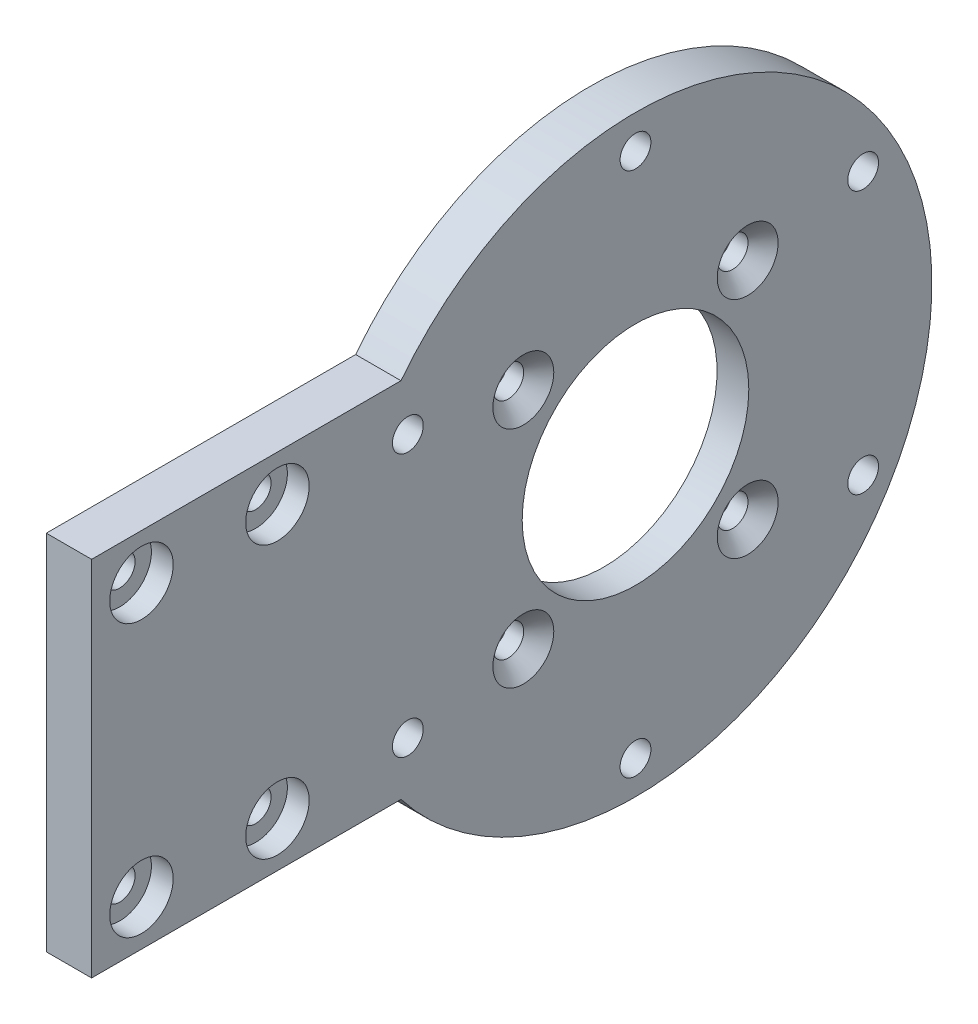
ISO-10303-21;
HEADER;
FILE_DESCRIPTION(('STEP AP214'),'2;1');
FILE_NAME('part.step','',(''),(''),'','','');
FILE_SCHEMA(('AUTOMOTIVE_DESIGN { 1 0 10303 214 1 1 1 1 }'));
ENDSEC;
DATA;
#1=APPLICATION_CONTEXT('core data for automotive mechanical design processes');
#2=APPLICATION_PROTOCOL_DEFINITION('international standard','automotive_design',2000,#1);
#3=PRODUCT_CONTEXT('',#1,'mechanical');
#4=PRODUCT('Part','Part','',(#3));
#5=PRODUCT_RELATED_PRODUCT_CATEGORY('part','',(#4));
#6=PRODUCT_DEFINITION_FORMATION('','',#4);
#7=PRODUCT_DEFINITION_CONTEXT('part definition',#1,'design');
#8=PRODUCT_DEFINITION('design','',#6,#7);
#9=PRODUCT_DEFINITION_SHAPE('','',#8);
#10=(LENGTH_UNIT() NAMED_UNIT(*) SI_UNIT(.MILLI.,.METRE.));
#11=(NAMED_UNIT(*) PLANE_ANGLE_UNIT() SI_UNIT($,.RADIAN.));
#12=(NAMED_UNIT(*) SI_UNIT($,.STERADIAN.) SOLID_ANGLE_UNIT());
#13=UNCERTAINTY_MEASURE_WITH_UNIT(LENGTH_MEASURE(1.E-05),#10,'distance_accuracy_value','');
#14=(GEOMETRIC_REPRESENTATION_CONTEXT(3) GLOBAL_UNCERTAINTY_ASSIGNED_CONTEXT((#13)) GLOBAL_UNIT_ASSIGNED_CONTEXT((#10,
#11,#12)) REPRESENTATION_CONTEXT('',''));
#15=CARTESIAN_POINT('',(0.,0.,0.));
#16=DIRECTION('',(0.,0.,1.));
#17=DIRECTION('',(1.,0.,0.));
#18=AXIS2_PLACEMENT_3D('',#15,#16,#17);
#19=CARTESIAN_POINT('',(2.5,0.,0.));
#20=DIRECTION('',(-1.,0.,0.));
#21=DIRECTION('',(0.,0.,1.));
#22=AXIS2_PLACEMENT_3D('',#19,#20,#21);
#23=CYLINDRICAL_SURFACE('',#22,12.5);
#24=CARTESIAN_POINT('',(2.5,0.,0.));
#25=DIRECTION('',(1.,0.,0.));
#26=DIRECTION('',(0.,0.,-1.));
#27=AXIS2_PLACEMENT_3D('',#24,#25,#26);
#28=CIRCLE('',#27,12.5);
#29=CARTESIAN_POINT('',(2.5,0.,-12.5));
#30=VERTEX_POINT('',#29);
#31=EDGE_CURVE('E104',#30,#30,#28,.T.);
#32=ORIENTED_EDGE('',*,*,#31,.T.);
#33=EDGE_LOOP('',(#32));
#34=FACE_BOUND('',#33,.T.);
#35=CARTESIAN_POINT('',(-1.,0.,0.));
#36=DIRECTION('',(-1.,0.,0.));
#37=DIRECTION('',(0.,0.,1.));
#38=AXIS2_PLACEMENT_3D('',#35,#36,#37);
#39=CIRCLE('',#38,12.5);
#40=CARTESIAN_POINT('',(-1.,0.,12.5));
#41=VERTEX_POINT('',#40);
#42=EDGE_CURVE('E110',#41,#41,#39,.T.);
#43=ORIENTED_EDGE('',*,*,#42,.T.);
#44=EDGE_LOOP('',(#43));
#45=FACE_BOUND('',#44,.T.);
#46=ADVANCED_FACE('F33',(#34,#45),#23,.F.);
#47=CARTESIAN_POINT('',(2.5,0.,0.));
#48=DIRECTION('',(1.,0.,0.));
#49=DIRECTION('',(0.,0.,-1.));
#50=AXIS2_PLACEMENT_3D('',#47,#48,#49);
#51=PLANE('',#50);
#52=CARTESIAN_POINT('',(2.5,15.,39.5));
#53=DIRECTION('',(1.,0.,0.));
#54=DIRECTION('',(0.,0.,-1.));
#55=AXIS2_PLACEMENT_3D('',#52,#53,#54);
#56=CIRCLE('',#55,3.5);
#57=CARTESIAN_POINT('',(2.5,15.,36.));
#58=VERTEX_POINT('',#57);
#59=EDGE_CURVE('E609',#58,#58,#56,.T.);
#60=ORIENTED_EDGE('',*,*,#59,.F.);
#61=EDGE_LOOP('',(#60));
#62=FACE_BOUND('',#61,.T.);
#63=CARTESIAN_POINT('',(2.5,-15.,54.5));
#64=DIRECTION('',(1.,0.,0.));
#65=DIRECTION('',(0.,0.,-1.));
#66=AXIS2_PLACEMENT_3D('',#63,#64,#65);
#67=CIRCLE('',#66,3.5);
#68=CARTESIAN_POINT('',(2.5,-15.,51.));
#69=VERTEX_POINT('',#68);
#70=EDGE_CURVE('E597',#69,#69,#67,.T.);
#71=ORIENTED_EDGE('',*,*,#70,.F.);
#72=EDGE_LOOP('',(#71));
#73=FACE_BOUND('',#72,.T.);
#74=CARTESIAN_POINT('',(2.5,15.,54.5));
#75=DIRECTION('',(1.,0.,0.));
#76=DIRECTION('',(0.,0.,-1.));
#77=AXIS2_PLACEMENT_3D('',#74,#75,#76);
#78=CIRCLE('',#77,3.5);
#79=CARTESIAN_POINT('',(2.5,15.,51.));
#80=VERTEX_POINT('',#79);
#81=EDGE_CURVE('E585',#80,#80,#78,.T.);
#82=ORIENTED_EDGE('',*,*,#81,.F.);
#83=EDGE_LOOP('',(#82));
#84=FACE_BOUND('',#83,.T.);
#85=CARTESIAN_POINT('',(2.5,-15.,39.5));
#86=DIRECTION('',(1.,0.,0.));
#87=DIRECTION('',(0.,0.,-1.));
#88=AXIS2_PLACEMENT_3D('',#85,#86,#87);
#89=CIRCLE('',#88,3.5);
#90=CARTESIAN_POINT('',(2.5,-15.,36.));
#91=VERTEX_POINT('',#90);
#92=EDGE_CURVE('E573',#91,#91,#89,.T.);
#93=ORIENTED_EDGE('',*,*,#92,.F.);
#94=EDGE_LOOP('',(#93));
#95=FACE_BOUND('',#94,.T.);
#96=CARTESIAN_POINT('',(2.5,29.,0.));
#97=DIRECTION('',(1.,0.,0.));
#98=DIRECTION('',(0.,0.,-1.));
#99=AXIS2_PLACEMENT_3D('',#96,#97,#98);
#100=CIRCLE('',#99,1.69999999999999);
#101=CARTESIAN_POINT('',(2.5,29.,-1.69999999999999));
#102=VERTEX_POINT('',#101);
#103=EDGE_CURVE('E561',#102,#102,#100,.T.);
#104=ORIENTED_EDGE('',*,*,#103,.F.);
#105=EDGE_LOOP('',(#104));
#106=FACE_BOUND('',#105,.T.);
#107=CARTESIAN_POINT('',(2.5,14.5,-25.1147367097487));
#108=DIRECTION('',(1.,0.,0.));
#109=DIRECTION('',(0.,0.,-1.));
#110=AXIS2_PLACEMENT_3D('',#107,#108,#109);
#111=CIRCLE('',#110,1.69999999999999);
#112=CARTESIAN_POINT('',(2.5,14.5,-26.8147367097487));
#113=VERTEX_POINT('',#112);
#114=EDGE_CURVE('E555',#113,#113,#111,.T.);
#115=ORIENTED_EDGE('',*,*,#114,.F.);
#116=EDGE_LOOP('',(#115));
#117=FACE_BOUND('',#116,.T.);
#118=CARTESIAN_POINT('',(2.5,-14.5,-25.1147367097487));
#119=DIRECTION('',(1.,0.,0.));
#120=DIRECTION('',(0.,0.,-1.));
#121=AXIS2_PLACEMENT_3D('',#118,#119,#120);
#122=CIRCLE('',#121,1.69999999999999);
#123=CARTESIAN_POINT('',(2.5,-14.5,-26.8147367097487));
#124=VERTEX_POINT('',#123);
#125=EDGE_CURVE('E549',#124,#124,#122,.T.);
#126=ORIENTED_EDGE('',*,*,#125,.F.);
#127=EDGE_LOOP('',(#126));
#128=FACE_BOUND('',#127,.T.);
#129=CARTESIAN_POINT('',(2.5,-29.,0.));
#130=DIRECTION('',(1.,0.,0.));
#131=DIRECTION('',(0.,0.,-1.));
#132=AXIS2_PLACEMENT_3D('',#129,#130,#131);
#133=CIRCLE('',#132,1.69999999999999);
#134=CARTESIAN_POINT('',(2.5,-29.,-1.69999999999999));
#135=VERTEX_POINT('',#134);
#136=EDGE_CURVE('E543',#135,#135,#133,.T.);
#137=ORIENTED_EDGE('',*,*,#136,.F.);
#138=EDGE_LOOP('',(#137));
#139=FACE_BOUND('',#138,.T.);
#140=CARTESIAN_POINT('',(2.5,-14.5,25.1147367097487));
#141=DIRECTION('',(1.,0.,0.));
#142=DIRECTION('',(0.,0.,-1.));
#143=AXIS2_PLACEMENT_3D('',#140,#141,#142);
#144=CIRCLE('',#143,1.69999999999999);
#145=CARTESIAN_POINT('',(2.5,-14.5,23.4147367097487));
#146=VERTEX_POINT('',#145);
#147=EDGE_CURVE('E537',#146,#146,#144,.T.);
#148=ORIENTED_EDGE('',*,*,#147,.F.);
#149=EDGE_LOOP('',(#148));
#150=FACE_BOUND('',#149,.T.);
#151=CARTESIAN_POINT('',(2.5,14.5,25.1147367097487));
#152=DIRECTION('',(1.,0.,0.));
#153=DIRECTION('',(0.,0.,-1.));
#154=AXIS2_PLACEMENT_3D('',#151,#152,#153);
#155=CIRCLE('',#154,1.69999999999999);
#156=CARTESIAN_POINT('',(2.5,14.5,23.4147367097487));
#157=VERTEX_POINT('',#156);
#158=EDGE_CURVE('E531',#157,#157,#155,.T.);
#159=ORIENTED_EDGE('',*,*,#158,.F.);
#160=EDGE_LOOP('',(#159));
#161=FACE_BOUND('',#160,.T.);
#162=CARTESIAN_POINT('',(2.5,12.3743686707646,-12.3743686707646));
#163=DIRECTION('',(1.,0.,0.));
#164=DIRECTION('',(0.,0.,-1.));
#165=AXIS2_PLACEMENT_3D('',#162,#163,#164);
#166=CIRCLE('',#165,3.36);
#167=CARTESIAN_POINT('',(2.5,12.3743686707646,-15.7343686707646));
#168=VERTEX_POINT('',#167);
#169=EDGE_CURVE('E522',#168,#168,#166,.T.);
#170=ORIENTED_EDGE('',*,*,#169,.F.);
#171=EDGE_LOOP('',(#170));
#172=FACE_BOUND('',#171,.T.);
#173=CARTESIAN_POINT('',(2.5,-12.3743686707646,12.3743686707646));
#174=DIRECTION('',(1.,0.,0.));
#175=DIRECTION('',(0.,0.,-1.));
#176=AXIS2_PLACEMENT_3D('',#173,#174,#175);
#177=CIRCLE('',#176,3.36);
#178=CARTESIAN_POINT('',(2.5,-12.3743686707646,9.01436867076458));
#179=VERTEX_POINT('',#178);
#180=EDGE_CURVE('E132',#179,#179,#177,.T.);
#181=ORIENTED_EDGE('',*,*,#180,.F.);
#182=EDGE_LOOP('',(#181));
#183=FACE_BOUND('',#182,.T.);
#184=CARTESIAN_POINT('',(2.5,12.3743686707646,12.3743686707646));
#185=DIRECTION('',(1.,0.,0.));
#186=DIRECTION('',(0.,0.,-1.));
#187=AXIS2_PLACEMENT_3D('',#184,#185,#186);
#188=CIRCLE('',#187,3.36);
#189=CARTESIAN_POINT('',(2.5,12.3743686707646,9.01436867076458));
#190=VERTEX_POINT('',#189);
#191=EDGE_CURVE('E125',#190,#190,#188,.T.);
#192=ORIENTED_EDGE('',*,*,#191,.F.);
#193=EDGE_LOOP('',(#192));
#194=FACE_BOUND('',#193,.T.);
#195=CARTESIAN_POINT('',(2.5,-12.3743686707646,-12.3743686707646));
#196=DIRECTION('',(1.,0.,0.));
#197=DIRECTION('',(0.,0.,-1.));
#198=AXIS2_PLACEMENT_3D('',#195,#196,#197);
#199=CIRCLE('',#198,3.36);
#200=CARTESIAN_POINT('',(2.5,-12.3743686707646,-15.7343686707646));
#201=VERTEX_POINT('',#200);
#202=EDGE_CURVE('E121',#201,#201,#199,.T.);
#203=ORIENTED_EDGE('',*,*,#202,.F.);
#204=EDGE_LOOP('',(#203));
#205=FACE_BOUND('',#204,.T.);
#206=CARTESIAN_POINT('',(2.5,0.,0.));
#207=DIRECTION('',(1.,0.,0.));
#208=DIRECTION('',(0.,0.,-1.));
#209=AXIS2_PLACEMENT_3D('',#206,#207,#208);
#210=CIRCLE('',#209,32.7);
#211=CARTESIAN_POINT('',(2.5,-20.,25.8706397292375));
#212=VERTEX_POINT('',#211);
#213=CARTESIAN_POINT('',(2.5,20.,25.8706397292375));
#214=VERTEX_POINT('',#213);
#215=EDGE_CURVE('E88',#212,#214,#210,.T.);
#216=ORIENTED_EDGE('',*,*,#215,.T.);
#217=DIRECTION('',(0.,0.,1.));
#218=VECTOR('',#217,1.);
#219=CARTESIAN_POINT('',(2.5,20.,25.8706397292375));
#220=LINE('',#219,#218);
#221=CARTESIAN_POINT('',(2.5,20.,60.));
#222=VERTEX_POINT('',#221);
#223=EDGE_CURVE('E82',#214,#222,#220,.T.);
#224=ORIENTED_EDGE('',*,*,#223,.T.);
#225=DIRECTION('',(0.,-1.,0.));
#226=VECTOR('',#225,1.);
#227=CARTESIAN_POINT('',(2.5,20.,60.));
#228=LINE('',#227,#226);
#229=CARTESIAN_POINT('',(2.5,-20.,60.));
#230=VERTEX_POINT('',#229);
#231=EDGE_CURVE('E86',#222,#230,#228,.T.);
#232=ORIENTED_EDGE('',*,*,#231,.T.);
#233=DIRECTION('',(0.,0.,-1.));
#234=VECTOR('',#233,1.);
#235=CARTESIAN_POINT('',(2.5,-20.,60.));
#236=LINE('',#235,#234);
#237=EDGE_CURVE('E52',#230,#212,#236,.T.);
#238=ORIENTED_EDGE('',*,*,#237,.T.);
#239=EDGE_LOOP('',(#216,#224,#232,#238));
#240=FACE_BOUND('',#239,.T.);
#241=ORIENTED_EDGE('',*,*,#31,.F.);
#242=EDGE_LOOP('',(#241));
#243=FACE_BOUND('',#242,.T.);
#244=ADVANCED_FACE('F83',(#62,#73,#84,#95,#106,#117,#128,#139,#150,#161,#172,#183,#194,#205,
#240,#243),#51,.T.);
#245=CARTESIAN_POINT('',(-2.5,0.,0.));
#246=DIRECTION('',(1.,0.,0.));
#247=DIRECTION('',(0.,0.,-1.));
#248=AXIS2_PLACEMENT_3D('',#245,#246,#247);
#249=PLANE('',#248);
#250=CARTESIAN_POINT('',(-2.5,15.,39.5));
#251=DIRECTION('',(1.,0.,0.));
#252=DIRECTION('',(0.,0.,-1.));
#253=AXIS2_PLACEMENT_3D('',#250,#251,#252);
#254=CIRCLE('',#253,1.7);
#255=CARTESIAN_POINT('',(-2.5,15.,37.8));
#256=VERTEX_POINT('',#255);
#257=EDGE_CURVE('E600',#256,#256,#254,.T.);
#258=ORIENTED_EDGE('',*,*,#257,.T.);
#259=EDGE_LOOP('',(#258));
#260=FACE_BOUND('',#259,.T.);
#261=CARTESIAN_POINT('',(-2.5,-15.,54.5));
#262=DIRECTION('',(1.,0.,0.));
#263=DIRECTION('',(0.,0.,-1.));
#264=AXIS2_PLACEMENT_3D('',#261,#262,#263);
#265=CIRCLE('',#264,1.7);
#266=CARTESIAN_POINT('',(-2.5,-15.,52.8));
#267=VERTEX_POINT('',#266);
#268=EDGE_CURVE('E588',#267,#267,#265,.T.);
#269=ORIENTED_EDGE('',*,*,#268,.T.);
#270=EDGE_LOOP('',(#269));
#271=FACE_BOUND('',#270,.T.);
#272=CARTESIAN_POINT('',(-2.5,15.,54.5));
#273=DIRECTION('',(1.,0.,0.));
#274=DIRECTION('',(0.,0.,-1.));
#275=AXIS2_PLACEMENT_3D('',#272,#273,#274);
#276=CIRCLE('',#275,1.7);
#277=CARTESIAN_POINT('',(-2.5,15.,52.8));
#278=VERTEX_POINT('',#277);
#279=EDGE_CURVE('E576',#278,#278,#276,.T.);
#280=ORIENTED_EDGE('',*,*,#279,.T.);
#281=EDGE_LOOP('',(#280));
#282=FACE_BOUND('',#281,.T.);
#283=CARTESIAN_POINT('',(-2.5,-15.,39.5));
#284=DIRECTION('',(1.,0.,0.));
#285=DIRECTION('',(0.,0.,-1.));
#286=AXIS2_PLACEMENT_3D('',#283,#284,#285);
#287=CIRCLE('',#286,1.7);
#288=CARTESIAN_POINT('',(-2.5,-15.,37.8));
#289=VERTEX_POINT('',#288);
#290=EDGE_CURVE('E564',#289,#289,#287,.T.);
#291=ORIENTED_EDGE('',*,*,#290,.T.);
#292=EDGE_LOOP('',(#291));
#293=FACE_BOUND('',#292,.T.);
#294=CARTESIAN_POINT('',(-2.5,29.,0.));
#295=DIRECTION('',(1.,0.,0.));
#296=DIRECTION('',(0.,0.,-1.));
#297=AXIS2_PLACEMENT_3D('',#294,#295,#296);
#298=CIRCLE('',#297,1.7);
#299=CARTESIAN_POINT('',(-2.5,29.,-1.7));
#300=VERTEX_POINT('',#299);
#301=EDGE_CURVE('E558',#300,#300,#298,.T.);
#302=ORIENTED_EDGE('',*,*,#301,.T.);
#303=EDGE_LOOP('',(#302));
#304=FACE_BOUND('',#303,.T.);
#305=CARTESIAN_POINT('',(-2.5,14.5,-25.1147367097487));
#306=DIRECTION('',(1.,0.,0.));
#307=DIRECTION('',(0.,0.,-1.));
#308=AXIS2_PLACEMENT_3D('',#305,#306,#307);
#309=CIRCLE('',#308,1.7);
#310=CARTESIAN_POINT('',(-2.5,14.5,-26.8147367097487));
#311=VERTEX_POINT('',#310);
#312=EDGE_CURVE('E552',#311,#311,#309,.T.);
#313=ORIENTED_EDGE('',*,*,#312,.T.);
#314=EDGE_LOOP('',(#313));
#315=FACE_BOUND('',#314,.T.);
#316=CARTESIAN_POINT('',(-2.5,-14.5,-25.1147367097487));
#317=DIRECTION('',(1.,0.,0.));
#318=DIRECTION('',(0.,0.,-1.));
#319=AXIS2_PLACEMENT_3D('',#316,#317,#318);
#320=CIRCLE('',#319,1.7);
#321=CARTESIAN_POINT('',(-2.5,-14.5,-26.8147367097487));
#322=VERTEX_POINT('',#321);
#323=EDGE_CURVE('E546',#322,#322,#320,.T.);
#324=ORIENTED_EDGE('',*,*,#323,.T.);
#325=EDGE_LOOP('',(#324));
#326=FACE_BOUND('',#325,.T.);
#327=CARTESIAN_POINT('',(-2.5,-29.,0.));
#328=DIRECTION('',(1.,0.,0.));
#329=DIRECTION('',(0.,0.,-1.));
#330=AXIS2_PLACEMENT_3D('',#327,#328,#329);
#331=CIRCLE('',#330,1.7);
#332=CARTESIAN_POINT('',(-2.5,-29.,-1.7));
#333=VERTEX_POINT('',#332);
#334=EDGE_CURVE('E540',#333,#333,#331,.T.);
#335=ORIENTED_EDGE('',*,*,#334,.T.);
#336=EDGE_LOOP('',(#335));
#337=FACE_BOUND('',#336,.T.);
#338=CARTESIAN_POINT('',(-2.5,-14.5,25.1147367097487));
#339=DIRECTION('',(1.,0.,0.));
#340=DIRECTION('',(0.,0.,-1.));
#341=AXIS2_PLACEMENT_3D('',#338,#339,#340);
#342=CIRCLE('',#341,1.7);
#343=CARTESIAN_POINT('',(-2.5,-14.5,23.4147367097487));
#344=VERTEX_POINT('',#343);
#345=EDGE_CURVE('E534',#344,#344,#342,.T.);
#346=ORIENTED_EDGE('',*,*,#345,.T.);
#347=EDGE_LOOP('',(#346));
#348=FACE_BOUND('',#347,.T.);
#349=CARTESIAN_POINT('',(-2.5,14.5,25.1147367097487));
#350=DIRECTION('',(1.,0.,0.));
#351=DIRECTION('',(0.,0.,-1.));
#352=AXIS2_PLACEMENT_3D('',#349,#350,#351);
#353=CIRCLE('',#352,1.7);
#354=CARTESIAN_POINT('',(-2.5,14.5,23.4147367097487));
#355=VERTEX_POINT('',#354);
#356=EDGE_CURVE('E526',#355,#355,#353,.T.);
#357=ORIENTED_EDGE('',*,*,#356,.T.);
#358=EDGE_LOOP('',(#357));
#359=FACE_BOUND('',#358,.T.);
#360=CARTESIAN_POINT('',(-2.5,0.,0.));
#361=DIRECTION('',(-1.,0.,0.));
#362=DIRECTION('',(0.,0.,1.));
#363=AXIS2_PLACEMENT_3D('',#360,#361,#362);
#364=CIRCLE('',#363,21.);
#365=CARTESIAN_POINT('',(-2.5,0.,21.));
#366=VERTEX_POINT('',#365);
#367=EDGE_CURVE('E117',#366,#366,#364,.T.);
#368=ORIENTED_EDGE('',*,*,#367,.F.);
#369=EDGE_LOOP('',(#368));
#370=FACE_BOUND('',#369,.T.);
#371=CARTESIAN_POINT('',(-2.5,0.,0.));
#372=DIRECTION('',(1.,0.,0.));
#373=DIRECTION('',(0.,0.,-1.));
#374=AXIS2_PLACEMENT_3D('',#371,#372,#373);
#375=CIRCLE('',#374,32.7);
#376=CARTESIAN_POINT('',(-2.5,-20.,25.8706397292375));
#377=VERTEX_POINT('',#376);
#378=CARTESIAN_POINT('',(-2.5,20.,25.8706397292375));
#379=VERTEX_POINT('',#378);
#380=EDGE_CURVE('E101',#377,#379,#375,.T.);
#381=ORIENTED_EDGE('',*,*,#380,.F.);
#382=DIRECTION('',(0.,0.,-1.));
#383=VECTOR('',#382,1.);
#384=CARTESIAN_POINT('',(-2.5,-20.,60.));
#385=LINE('',#384,#383);
#386=CARTESIAN_POINT('',(-2.5,-20.,60.));
#387=VERTEX_POINT('',#386);
#388=EDGE_CURVE('E75',#387,#377,#385,.T.);
#389=ORIENTED_EDGE('',*,*,#388,.F.);
#390=DIRECTION('',(0.,-1.,0.));
#391=VECTOR('',#390,1.);
#392=CARTESIAN_POINT('',(-2.5,20.,60.));
#393=LINE('',#392,#391);
#394=CARTESIAN_POINT('',(-2.5,20.,60.));
#395=VERTEX_POINT('',#394);
#396=EDGE_CURVE('E69',#395,#387,#393,.T.);
#397=ORIENTED_EDGE('',*,*,#396,.F.);
#398=DIRECTION('',(0.,0.,1.));
#399=VECTOR('',#398,1.);
#400=CARTESIAN_POINT('',(-2.5,20.,25.8706397292375));
#401=LINE('',#400,#399);
#402=EDGE_CURVE('E92',#379,#395,#401,.T.);
#403=ORIENTED_EDGE('',*,*,#402,.F.);
#404=EDGE_LOOP('',(#381,#389,#397,#403));
#405=FACE_BOUND('',#404,.T.);
#406=ADVANCED_FACE('F155',(#260,#271,#282,#293,#304,#315,#326,#337,#348,#359,#370,#405),#249,.F.);
#407=CARTESIAN_POINT('',(2.5,0.,0.));
#408=DIRECTION('',(-1.,0.,0.));
#409=DIRECTION('',(0.,0.,1.));
#410=AXIS2_PLACEMENT_3D('',#407,#408,#409);
#411=CYLINDRICAL_SURFACE('',#410,32.7);
#412=ORIENTED_EDGE('',*,*,#380,.T.);
#413=DIRECTION('',(-1.,0.,0.));
#414=VECTOR('',#413,1.);
#415=CARTESIAN_POINT('',(2.5,20.,25.8706397292375));
#416=LINE('',#415,#414);
#417=EDGE_CURVE('E11',#214,#379,#416,.T.);
#418=ORIENTED_EDGE('',*,*,#417,.F.);
#419=ORIENTED_EDGE('',*,*,#215,.F.);
#420=DIRECTION('',(-1.,0.,0.));
#421=VECTOR('',#420,1.);
#422=CARTESIAN_POINT('',(2.5,-20.,25.8706397292375));
#423=LINE('',#422,#421);
#424=EDGE_CURVE('E97',#212,#377,#423,.T.);
#425=ORIENTED_EDGE('',*,*,#424,.T.);
#426=EDGE_LOOP('',(#412,#418,#419,#425));
#427=FACE_BOUND('',#426,.T.);
#428=ADVANCED_FACE('F35',(#427),#411,.T.);
#429=CARTESIAN_POINT('',(2.5,20.,25.8706397292375));
#430=DIRECTION('',(0.,-1.,0.));
#431=DIRECTION('',(0.,0.,-1.));
#432=AXIS2_PLACEMENT_3D('',#429,#430,#431);
#433=PLANE('',#432);
#434=ORIENTED_EDGE('',*,*,#402,.T.);
#435=DIRECTION('',(-1.,0.,0.));
#436=VECTOR('',#435,1.);
#437=CARTESIAN_POINT('',(2.5,20.,60.));
#438=LINE('',#437,#436);
#439=EDGE_CURVE('E43',#222,#395,#438,.T.);
#440=ORIENTED_EDGE('',*,*,#439,.F.);
#441=ORIENTED_EDGE('',*,*,#223,.F.);
#442=ORIENTED_EDGE('',*,*,#417,.T.);
#443=EDGE_LOOP('',(#434,#440,#441,#442));
#444=FACE_BOUND('',#443,.T.);
#445=ADVANCED_FACE('F91',(#444),#433,.F.);
#446=CARTESIAN_POINT('',(2.5,20.,60.));
#447=DIRECTION('',(0.,0.,-1.));
#448=DIRECTION('',(-1.,0.,0.));
#449=AXIS2_PLACEMENT_3D('',#446,#447,#448);
#450=PLANE('',#449);
#451=ORIENTED_EDGE('',*,*,#396,.T.);
#452=DIRECTION('',(-1.,0.,0.));
#453=VECTOR('',#452,1.);
#454=CARTESIAN_POINT('',(2.5,-20.,60.));
#455=LINE('',#454,#453);
#456=EDGE_CURVE('E93',#230,#387,#455,.T.);
#457=ORIENTED_EDGE('',*,*,#456,.F.);
#458=ORIENTED_EDGE('',*,*,#231,.F.);
#459=ORIENTED_EDGE('',*,*,#439,.T.);
#460=EDGE_LOOP('',(#451,#457,#458,#459));
#461=FACE_BOUND('',#460,.T.);
#462=ADVANCED_FACE('F95',(#461),#450,.F.);
#463=CARTESIAN_POINT('',(2.5,-20.,60.));
#464=DIRECTION('',(0.,1.,0.));
#465=DIRECTION('',(0.,0.,1.));
#466=AXIS2_PLACEMENT_3D('',#463,#464,#465);
#467=PLANE('',#466);
#468=ORIENTED_EDGE('',*,*,#388,.T.);
#469=ORIENTED_EDGE('',*,*,#424,.F.);
#470=ORIENTED_EDGE('',*,*,#237,.F.);
#471=ORIENTED_EDGE('',*,*,#456,.T.);
#472=EDGE_LOOP('',(#468,#469,#470,#471));
#473=FACE_BOUND('',#472,.T.);
#474=ADVANCED_FACE('F169',(#473),#467,.F.);
#475=CARTESIAN_POINT('',(-1.,0.,0.));
#476=DIRECTION('',(-1.,0.,0.));
#477=DIRECTION('',(0.,0.,1.));
#478=AXIS2_PLACEMENT_3D('',#475,#476,#477);
#479=CYLINDRICAL_SURFACE('',#478,21.);
#480=CARTESIAN_POINT('',(-1.,0.,0.));
#481=DIRECTION('',(-1.,0.,0.));
#482=DIRECTION('',(0.,0.,1.));
#483=AXIS2_PLACEMENT_3D('',#480,#481,#482);
#484=CIRCLE('',#483,21.);
#485=CARTESIAN_POINT('',(-1.,0.,21.));
#486=VERTEX_POINT('',#485);
#487=EDGE_CURVE('E113',#486,#486,#484,.T.);
#488=ORIENTED_EDGE('',*,*,#487,.F.);
#489=EDGE_LOOP('',(#488));
#490=FACE_BOUND('',#489,.T.);
#491=ORIENTED_EDGE('',*,*,#367,.T.);
#492=EDGE_LOOP('',(#491));
#493=FACE_BOUND('',#492,.T.);
#494=ADVANCED_FACE('F172',(#490,#493),#479,.F.);
#495=CARTESIAN_POINT('',(-1.,0.,0.));
#496=DIRECTION('',(-1.,0.,0.));
#497=DIRECTION('',(0.,0.,1.));
#498=AXIS2_PLACEMENT_3D('',#495,#496,#497);
#499=PLANE('',#498);
#500=CARTESIAN_POINT('',(-1.,12.3743686707646,-12.3743686707646));
#501=DIRECTION('',(-1.,0.,0.));
#502=DIRECTION('',(0.,0.,1.));
#503=AXIS2_PLACEMENT_3D('',#500,#501,#502);
#504=CIRCLE('',#503,1.69999999999999);
#505=CARTESIAN_POINT('',(-1.,12.3743686707646,-10.6743686707646));
#506=VERTEX_POINT('',#505);
#507=EDGE_CURVE('E37',#506,#506,#504,.T.);
#508=ORIENTED_EDGE('',*,*,#507,.F.);
#509=EDGE_LOOP('',(#508));
#510=FACE_BOUND('',#509,.T.);
#511=CARTESIAN_POINT('',(-1.,-12.3743686707646,12.3743686707646));
#512=DIRECTION('',(-1.,0.,0.));
#513=DIRECTION('',(0.,0.,1.));
#514=AXIS2_PLACEMENT_3D('',#511,#512,#513);
#515=CIRCLE('',#514,1.69999999999999);
#516=CARTESIAN_POINT('',(-1.,-12.3743686707646,14.0743686707646));
#517=VERTEX_POINT('',#516);
#518=EDGE_CURVE('E123',#517,#517,#515,.T.);
#519=ORIENTED_EDGE('',*,*,#518,.F.);
#520=EDGE_LOOP('',(#519));
#521=FACE_BOUND('',#520,.T.);
#522=CARTESIAN_POINT('',(-1.,12.3743686707646,12.3743686707646));
#523=DIRECTION('',(-1.,0.,0.));
#524=DIRECTION('',(0.,0.,1.));
#525=AXIS2_PLACEMENT_3D('',#522,#523,#524);
#526=CIRCLE('',#525,1.69999999999999);
#527=CARTESIAN_POINT('',(-1.,12.3743686707646,14.0743686707646));
#528=VERTEX_POINT('',#527);
#529=EDGE_CURVE('E119',#528,#528,#526,.T.);
#530=ORIENTED_EDGE('',*,*,#529,.F.);
#531=EDGE_LOOP('',(#530));
#532=FACE_BOUND('',#531,.T.);
#533=CARTESIAN_POINT('',(-1.,-12.3743686707646,-12.3743686707646));
#534=DIRECTION('',(-1.,0.,0.));
#535=DIRECTION('',(0.,0.,1.));
#536=AXIS2_PLACEMENT_3D('',#533,#534,#535);
#537=CIRCLE('',#536,1.69999999999999);
#538=CARTESIAN_POINT('',(-1.,-12.3743686707646,-10.6743686707646));
#539=VERTEX_POINT('',#538);
#540=EDGE_CURVE('E114',#539,#539,#537,.T.);
#541=ORIENTED_EDGE('',*,*,#540,.F.);
#542=EDGE_LOOP('',(#541));
#543=FACE_BOUND('',#542,.T.);
#544=ORIENTED_EDGE('',*,*,#42,.F.);
#545=EDGE_LOOP('',(#544));
#546=FACE_BOUND('',#545,.T.);
#547=ORIENTED_EDGE('',*,*,#487,.T.);
#548=EDGE_LOOP('',(#547));
#549=FACE_BOUND('',#548,.T.);
#550=ADVANCED_FACE('F372',(#510,#521,#532,#543,#546,#549),#499,.T.);
#551=CARTESIAN_POINT('',(2.5,-12.3743686707646,-12.3743686707646));
#552=DIRECTION('',(1.,0.,0.));
#553=DIRECTION('',(0.,0.,-1.));
#554=AXIS2_PLACEMENT_3D('',#551,#552,#553);
#555=CYLINDRICAL_SURFACE('',#554,1.69999999999999);
#556=ORIENTED_EDGE('',*,*,#540,.T.);
#557=EDGE_LOOP('',(#556));
#558=FACE_BOUND('',#557,.T.);
#559=CARTESIAN_POINT('',(0.839999999999998,-12.3743686707646,-12.3743686707646));
#560=DIRECTION('',(1.,0.,0.));
#561=DIRECTION('',(0.,0.,-1.));
#562=AXIS2_PLACEMENT_3D('',#559,#560,#561);
#563=CIRCLE('',#562,1.7);
#564=CARTESIAN_POINT('',(0.839999999999998,-12.3743686707646,-14.0743686707646));
#565=VERTEX_POINT('',#564);
#566=EDGE_CURVE('E118',#565,#565,#563,.T.);
#567=ORIENTED_EDGE('',*,*,#566,.T.);
#568=EDGE_LOOP('',(#567));
#569=FACE_BOUND('',#568,.T.);
#570=ADVANCED_FACE('F368',(#558,#569),#555,.F.);
#571=CARTESIAN_POINT('',(2.5,-12.3743686707646,-12.3743686707646));
#572=DIRECTION('',(1.,0.,0.));
#573=DIRECTION('',(0.,0.,-1.));
#574=AXIS2_PLACEMENT_3D('',#571,#572,#573);
#575=CONICAL_SURFACE('',#574,3.36,0.785398163397448);
#576=ORIENTED_EDGE('',*,*,#566,.F.);
#577=EDGE_LOOP('',(#576));
#578=FACE_BOUND('',#577,.T.);
#579=ORIENTED_EDGE('',*,*,#202,.T.);
#580=EDGE_LOOP('',(#579));
#581=FACE_BOUND('',#580,.T.);
#582=ADVANCED_FACE('F364',(#578,#581),#575,.F.);
#583=CARTESIAN_POINT('',(2.5,12.3743686707646,12.3743686707646));
#584=DIRECTION('',(1.,0.,0.));
#585=DIRECTION('',(0.,0.,-1.));
#586=AXIS2_PLACEMENT_3D('',#583,#584,#585);
#587=CYLINDRICAL_SURFACE('',#586,1.69999999999999);
#588=ORIENTED_EDGE('',*,*,#529,.T.);
#589=EDGE_LOOP('',(#588));
#590=FACE_BOUND('',#589,.T.);
#591=CARTESIAN_POINT('',(0.839999999999998,12.3743686707646,12.3743686707646));
#592=DIRECTION('',(1.,0.,0.));
#593=DIRECTION('',(0.,0.,-1.));
#594=AXIS2_PLACEMENT_3D('',#591,#592,#593);
#595=CIRCLE('',#594,1.7);
#596=CARTESIAN_POINT('',(0.839999999999998,12.3743686707646,10.6743686707646));
#597=VERTEX_POINT('',#596);
#598=EDGE_CURVE('E122',#597,#597,#595,.T.);
#599=ORIENTED_EDGE('',*,*,#598,.T.);
#600=EDGE_LOOP('',(#599));
#601=FACE_BOUND('',#600,.T.);
#602=ADVANCED_FACE('F360',(#590,#601),#587,.F.);
#603=CARTESIAN_POINT('',(2.5,12.3743686707646,12.3743686707646));
#604=DIRECTION('',(1.,0.,0.));
#605=DIRECTION('',(0.,0.,-1.));
#606=AXIS2_PLACEMENT_3D('',#603,#604,#605);
#607=CONICAL_SURFACE('',#606,3.36,0.785398163397448);
#608=ORIENTED_EDGE('',*,*,#598,.F.);
#609=EDGE_LOOP('',(#608));
#610=FACE_BOUND('',#609,.T.);
#611=ORIENTED_EDGE('',*,*,#191,.T.);
#612=EDGE_LOOP('',(#611));
#613=FACE_BOUND('',#612,.T.);
#614=ADVANCED_FACE('F357',(#610,#613),#607,.F.);
#615=CARTESIAN_POINT('',(2.5,-12.3743686707646,12.3743686707646));
#616=DIRECTION('',(1.,0.,0.));
#617=DIRECTION('',(0.,0.,-1.));
#618=AXIS2_PLACEMENT_3D('',#615,#616,#617);
#619=CYLINDRICAL_SURFACE('',#618,1.69999999999999);
#620=ORIENTED_EDGE('',*,*,#518,.T.);
#621=EDGE_LOOP('',(#620));
#622=FACE_BOUND('',#621,.T.);
#623=CARTESIAN_POINT('',(0.839999999999998,-12.3743686707646,12.3743686707646));
#624=DIRECTION('',(1.,0.,0.));
#625=DIRECTION('',(0.,0.,-1.));
#626=AXIS2_PLACEMENT_3D('',#623,#624,#625);
#627=CIRCLE('',#626,1.7);
#628=CARTESIAN_POINT('',(0.839999999999998,-12.3743686707646,10.6743686707646));
#629=VERTEX_POINT('',#628);
#630=EDGE_CURVE('E126',#629,#629,#627,.T.);
#631=ORIENTED_EDGE('',*,*,#630,.T.);
#632=EDGE_LOOP('',(#631));
#633=FACE_BOUND('',#632,.T.);
#634=ADVANCED_FACE('F353',(#622,#633),#619,.F.);
#635=CARTESIAN_POINT('',(2.5,-12.3743686707646,12.3743686707646));
#636=DIRECTION('',(1.,0.,0.));
#637=DIRECTION('',(0.,0.,-1.));
#638=AXIS2_PLACEMENT_3D('',#635,#636,#637);
#639=CONICAL_SURFACE('',#638,3.36,0.785398163397448);
#640=ORIENTED_EDGE('',*,*,#630,.F.);
#641=EDGE_LOOP('',(#640));
#642=FACE_BOUND('',#641,.T.);
#643=ORIENTED_EDGE('',*,*,#180,.T.);
#644=EDGE_LOOP('',(#643));
#645=FACE_BOUND('',#644,.T.);
#646=ADVANCED_FACE('F349',(#642,#645),#639,.F.);
#647=CARTESIAN_POINT('',(2.5,12.3743686707646,-12.3743686707646));
#648=DIRECTION('',(1.,0.,0.));
#649=DIRECTION('',(0.,0.,-1.));
#650=AXIS2_PLACEMENT_3D('',#647,#648,#649);
#651=CYLINDRICAL_SURFACE('',#650,1.69999999999999);
#652=ORIENTED_EDGE('',*,*,#507,.T.);
#653=EDGE_LOOP('',(#652));
#654=FACE_BOUND('',#653,.T.);
#655=CARTESIAN_POINT('',(0.839999999999998,12.3743686707646,-12.3743686707646));
#656=DIRECTION('',(1.,0.,0.));
#657=DIRECTION('',(0.,0.,-1.));
#658=AXIS2_PLACEMENT_3D('',#655,#656,#657);
#659=CIRCLE('',#658,1.7);
#660=CARTESIAN_POINT('',(0.839999999999998,12.3743686707646,-14.0743686707646));
#661=VERTEX_POINT('',#660);
#662=EDGE_CURVE('E520',#661,#661,#659,.T.);
#663=ORIENTED_EDGE('',*,*,#662,.T.);
#664=EDGE_LOOP('',(#663));
#665=FACE_BOUND('',#664,.T.);
#666=ADVANCED_FACE('F345',(#654,#665),#651,.F.);
#667=CARTESIAN_POINT('',(2.5,12.3743686707646,-12.3743686707646));
#668=DIRECTION('',(1.,0.,0.));
#669=DIRECTION('',(0.,0.,-1.));
#670=AXIS2_PLACEMENT_3D('',#667,#668,#669);
#671=CONICAL_SURFACE('',#670,3.36,0.785398163397448);
#672=ORIENTED_EDGE('',*,*,#662,.F.);
#673=EDGE_LOOP('',(#672));
#674=FACE_BOUND('',#673,.T.);
#675=ORIENTED_EDGE('',*,*,#169,.T.);
#676=EDGE_LOOP('',(#675));
#677=FACE_BOUND('',#676,.T.);
#678=ADVANCED_FACE('F341',(#674,#677),#671,.F.);
#679=CARTESIAN_POINT('',(2.5,14.5,25.1147367097487));
#680=DIRECTION('',(1.,0.,0.));
#681=DIRECTION('',(0.,0.,-1.));
#682=AXIS2_PLACEMENT_3D('',#679,#680,#681);
#683=CYLINDRICAL_SURFACE('',#682,1.69999999999999);
#684=ORIENTED_EDGE('',*,*,#356,.F.);
#685=EDGE_LOOP('',(#684));
#686=FACE_BOUND('',#685,.T.);
#687=ORIENTED_EDGE('',*,*,#158,.T.);
#688=EDGE_LOOP('',(#687));
#689=FACE_BOUND('',#688,.T.);
#690=ADVANCED_FACE('F337',(#686,#689),#683,.F.);
#691=CARTESIAN_POINT('',(2.5,-14.5,25.1147367097487));
#692=DIRECTION('',(1.,0.,0.));
#693=DIRECTION('',(0.,0.,-1.));
#694=AXIS2_PLACEMENT_3D('',#691,#692,#693);
#695=CYLINDRICAL_SURFACE('',#694,1.69999999999999);
#696=ORIENTED_EDGE('',*,*,#345,.F.);
#697=EDGE_LOOP('',(#696));
#698=FACE_BOUND('',#697,.T.);
#699=ORIENTED_EDGE('',*,*,#147,.T.);
#700=EDGE_LOOP('',(#699));
#701=FACE_BOUND('',#700,.T.);
#702=ADVANCED_FACE('F333',(#698,#701),#695,.F.);
#703=CARTESIAN_POINT('',(2.5,-29.,0.));
#704=DIRECTION('',(1.,0.,0.));
#705=DIRECTION('',(0.,0.,-1.));
#706=AXIS2_PLACEMENT_3D('',#703,#704,#705);
#707=CYLINDRICAL_SURFACE('',#706,1.69999999999999);
#708=ORIENTED_EDGE('',*,*,#334,.F.);
#709=EDGE_LOOP('',(#708));
#710=FACE_BOUND('',#709,.T.);
#711=ORIENTED_EDGE('',*,*,#136,.T.);
#712=EDGE_LOOP('',(#711));
#713=FACE_BOUND('',#712,.T.);
#714=ADVANCED_FACE('F329',(#710,#713),#707,.F.);
#715=CARTESIAN_POINT('',(2.5,-14.5,-25.1147367097487));
#716=DIRECTION('',(1.,0.,0.));
#717=DIRECTION('',(0.,0.,-1.));
#718=AXIS2_PLACEMENT_3D('',#715,#716,#717);
#719=CYLINDRICAL_SURFACE('',#718,1.69999999999999);
#720=ORIENTED_EDGE('',*,*,#323,.F.);
#721=EDGE_LOOP('',(#720));
#722=FACE_BOUND('',#721,.T.);
#723=ORIENTED_EDGE('',*,*,#125,.T.);
#724=EDGE_LOOP('',(#723));
#725=FACE_BOUND('',#724,.T.);
#726=ADVANCED_FACE('F325',(#722,#725),#719,.F.);
#727=CARTESIAN_POINT('',(2.5,14.5,-25.1147367097487));
#728=DIRECTION('',(1.,0.,0.));
#729=DIRECTION('',(0.,0.,-1.));
#730=AXIS2_PLACEMENT_3D('',#727,#728,#729);
#731=CYLINDRICAL_SURFACE('',#730,1.69999999999999);
#732=ORIENTED_EDGE('',*,*,#312,.F.);
#733=EDGE_LOOP('',(#732));
#734=FACE_BOUND('',#733,.T.);
#735=ORIENTED_EDGE('',*,*,#114,.T.);
#736=EDGE_LOOP('',(#735));
#737=FACE_BOUND('',#736,.T.);
#738=ADVANCED_FACE('F321',(#734,#737),#731,.F.);
#739=CARTESIAN_POINT('',(2.5,29.,0.));
#740=DIRECTION('',(1.,0.,0.));
#741=DIRECTION('',(0.,0.,-1.));
#742=AXIS2_PLACEMENT_3D('',#739,#740,#741);
#743=CYLINDRICAL_SURFACE('',#742,1.69999999999999);
#744=ORIENTED_EDGE('',*,*,#301,.F.);
#745=EDGE_LOOP('',(#744));
#746=FACE_BOUND('',#745,.T.);
#747=ORIENTED_EDGE('',*,*,#103,.T.);
#748=EDGE_LOOP('',(#747));
#749=FACE_BOUND('',#748,.T.);
#750=ADVANCED_FACE('F201',(#746,#749),#743,.F.);
#751=CARTESIAN_POINT('',(2.5,-15.,39.5));
#752=DIRECTION('',(1.,0.,0.));
#753=DIRECTION('',(0.,0.,-1.));
#754=AXIS2_PLACEMENT_3D('',#751,#752,#753);
#755=CYLINDRICAL_SURFACE('',#754,1.70000000000001);
#756=ORIENTED_EDGE('',*,*,#290,.F.);
#757=EDGE_LOOP('',(#756));
#758=FACE_BOUND('',#757,.T.);
#759=CARTESIAN_POINT('',(0.100000000000001,-15.,39.5));
#760=DIRECTION('',(1.,0.,0.));
#761=DIRECTION('',(0.,0.,-1.));
#762=AXIS2_PLACEMENT_3D('',#759,#760,#761);
#763=CIRCLE('',#762,1.70000000000001);
#764=CARTESIAN_POINT('',(0.100000000000001,-15.,37.8));
#765=VERTEX_POINT('',#764);
#766=EDGE_CURVE('E567',#765,#765,#763,.T.);
#767=ORIENTED_EDGE('',*,*,#766,.T.);
#768=EDGE_LOOP('',(#767));
#769=FACE_BOUND('',#768,.T.);
#770=ADVANCED_FACE('F195',(#758,#769),#755,.F.);
#771=CARTESIAN_POINT('',(0.100000000000001,-13.3,39.5));
#772=DIRECTION('',(-1.,0.,0.));
#773=DIRECTION('',(0.,0.,1.));
#774=AXIS2_PLACEMENT_3D('',#771,#772,#773);
#775=PLANE('',#774);
#776=ORIENTED_EDGE('',*,*,#766,.F.);
#777=EDGE_LOOP('',(#776));
#778=FACE_BOUND('',#777,.T.);
#779=CARTESIAN_POINT('',(0.100000000000001,-15.,39.5));
#780=DIRECTION('',(1.,0.,0.));
#781=DIRECTION('',(0.,0.,-1.));
#782=AXIS2_PLACEMENT_3D('',#779,#780,#781);
#783=CIRCLE('',#782,3.5);
#784=CARTESIAN_POINT('',(0.100000000000001,-15.,36.));
#785=VERTEX_POINT('',#784);
#786=EDGE_CURVE('E570',#785,#785,#783,.T.);
#787=ORIENTED_EDGE('',*,*,#786,.T.);
#788=EDGE_LOOP('',(#787));
#789=FACE_BOUND('',#788,.T.);
#790=ADVANCED_FACE('F200',(#778,#789),#775,.F.);
#791=CARTESIAN_POINT('',(2.5,-15.,39.5));
#792=DIRECTION('',(1.,0.,0.));
#793=DIRECTION('',(0.,0.,-1.));
#794=AXIS2_PLACEMENT_3D('',#791,#792,#793);
#795=CYLINDRICAL_SURFACE('',#794,3.5);
#796=ORIENTED_EDGE('',*,*,#786,.F.);
#797=EDGE_LOOP('',(#796));
#798=FACE_BOUND('',#797,.T.);
#799=ORIENTED_EDGE('',*,*,#92,.T.);
#800=EDGE_LOOP('',(#799));
#801=FACE_BOUND('',#800,.T.);
#802=ADVANCED_FACE('F213',(#798,#801),#795,.F.);
#803=CARTESIAN_POINT('',(2.5,15.,54.5));
#804=DIRECTION('',(1.,0.,0.));
#805=DIRECTION('',(0.,0.,-1.));
#806=AXIS2_PLACEMENT_3D('',#803,#804,#805);
#807=CYLINDRICAL_SURFACE('',#806,1.70000000000001);
#808=ORIENTED_EDGE('',*,*,#279,.F.);
#809=EDGE_LOOP('',(#808));
#810=FACE_BOUND('',#809,.T.);
#811=CARTESIAN_POINT('',(0.100000000000001,15.,54.5));
#812=DIRECTION('',(1.,0.,0.));
#813=DIRECTION('',(0.,0.,-1.));
#814=AXIS2_PLACEMENT_3D('',#811,#812,#813);
#815=CIRCLE('',#814,1.70000000000001);
#816=CARTESIAN_POINT('',(0.100000000000001,15.,52.8));
#817=VERTEX_POINT('',#816);
#818=EDGE_CURVE('E579',#817,#817,#815,.T.);
#819=ORIENTED_EDGE('',*,*,#818,.T.);
#820=EDGE_LOOP('',(#819));
#821=FACE_BOUND('',#820,.T.);
#822=ADVANCED_FACE('F223',(#810,#821),#807,.F.);
#823=CARTESIAN_POINT('',(0.100000000000001,16.7,54.5));
#824=DIRECTION('',(-1.,0.,0.));
#825=DIRECTION('',(0.,0.,1.));
#826=AXIS2_PLACEMENT_3D('',#823,#824,#825);
#827=PLANE('',#826);
#828=ORIENTED_EDGE('',*,*,#818,.F.);
#829=EDGE_LOOP('',(#828));
#830=FACE_BOUND('',#829,.T.);
#831=CARTESIAN_POINT('',(0.100000000000001,15.,54.5));
#832=DIRECTION('',(1.,0.,0.));
#833=DIRECTION('',(0.,0.,-1.));
#834=AXIS2_PLACEMENT_3D('',#831,#832,#833);
#835=CIRCLE('',#834,3.5);
#836=CARTESIAN_POINT('',(0.100000000000001,15.,51.));
#837=VERTEX_POINT('',#836);
#838=EDGE_CURVE('E582',#837,#837,#835,.T.);
#839=ORIENTED_EDGE('',*,*,#838,.T.);
#840=EDGE_LOOP('',(#839));
#841=FACE_BOUND('',#840,.T.);
#842=ADVANCED_FACE('F233',(#830,#841),#827,.F.);
#843=CARTESIAN_POINT('',(2.5,15.,54.5));
#844=DIRECTION('',(1.,0.,0.));
#845=DIRECTION('',(0.,0.,-1.));
#846=AXIS2_PLACEMENT_3D('',#843,#844,#845);
#847=CYLINDRICAL_SURFACE('',#846,3.5);
#848=ORIENTED_EDGE('',*,*,#838,.F.);
#849=EDGE_LOOP('',(#848));
#850=FACE_BOUND('',#849,.T.);
#851=ORIENTED_EDGE('',*,*,#81,.T.);
#852=EDGE_LOOP('',(#851));
#853=FACE_BOUND('',#852,.T.);
#854=ADVANCED_FACE('F243',(#850,#853),#847,.F.);
#855=CARTESIAN_POINT('',(2.5,-15.,54.5));
#856=DIRECTION('',(1.,0.,0.));
#857=DIRECTION('',(0.,0.,-1.));
#858=AXIS2_PLACEMENT_3D('',#855,#856,#857);
#859=CYLINDRICAL_SURFACE('',#858,1.70000000000001);
#860=ORIENTED_EDGE('',*,*,#268,.F.);
#861=EDGE_LOOP('',(#860));
#862=FACE_BOUND('',#861,.T.);
#863=CARTESIAN_POINT('',(0.100000000000001,-15.,54.5));
#864=DIRECTION('',(1.,0.,0.));
#865=DIRECTION('',(0.,0.,-1.));
#866=AXIS2_PLACEMENT_3D('',#863,#864,#865);
#867=CIRCLE('',#866,1.70000000000001);
#868=CARTESIAN_POINT('',(0.100000000000001,-15.,52.8));
#869=VERTEX_POINT('',#868);
#870=EDGE_CURVE('E591',#869,#869,#867,.T.);
#871=ORIENTED_EDGE('',*,*,#870,.T.);
#872=EDGE_LOOP('',(#871));
#873=FACE_BOUND('',#872,.T.);
#874=ADVANCED_FACE('F253',(#862,#873),#859,.F.);
#875=CARTESIAN_POINT('',(0.100000000000001,-13.3,54.5));
#876=DIRECTION('',(-1.,0.,0.));
#877=DIRECTION('',(0.,0.,1.));
#878=AXIS2_PLACEMENT_3D('',#875,#876,#877);
#879=PLANE('',#878);
#880=ORIENTED_EDGE('',*,*,#870,.F.);
#881=EDGE_LOOP('',(#880));
#882=FACE_BOUND('',#881,.T.);
#883=CARTESIAN_POINT('',(0.100000000000001,-15.,54.5));
#884=DIRECTION('',(1.,0.,0.));
#885=DIRECTION('',(0.,0.,-1.));
#886=AXIS2_PLACEMENT_3D('',#883,#884,#885);
#887=CIRCLE('',#886,3.5);
#888=CARTESIAN_POINT('',(0.100000000000001,-15.,51.));
#889=VERTEX_POINT('',#888);
#890=EDGE_CURVE('E594',#889,#889,#887,.T.);
#891=ORIENTED_EDGE('',*,*,#890,.T.);
#892=EDGE_LOOP('',(#891));
#893=FACE_BOUND('',#892,.T.);
#894=ADVANCED_FACE('F263',(#882,#893),#879,.F.);
#895=CARTESIAN_POINT('',(2.5,-15.,54.5));
#896=DIRECTION('',(1.,0.,0.));
#897=DIRECTION('',(0.,0.,-1.));
#898=AXIS2_PLACEMENT_3D('',#895,#896,#897);
#899=CYLINDRICAL_SURFACE('',#898,3.5);
#900=ORIENTED_EDGE('',*,*,#890,.F.);
#901=EDGE_LOOP('',(#900));
#902=FACE_BOUND('',#901,.T.);
#903=ORIENTED_EDGE('',*,*,#70,.T.);
#904=EDGE_LOOP('',(#903));
#905=FACE_BOUND('',#904,.T.);
#906=ADVANCED_FACE('F273',(#902,#905),#899,.F.);
#907=CARTESIAN_POINT('',(2.5,15.,39.5));
#908=DIRECTION('',(1.,0.,0.));
#909=DIRECTION('',(0.,0.,-1.));
#910=AXIS2_PLACEMENT_3D('',#907,#908,#909);
#911=CYLINDRICAL_SURFACE('',#910,1.70000000000001);
#912=ORIENTED_EDGE('',*,*,#257,.F.);
#913=EDGE_LOOP('',(#912));
#914=FACE_BOUND('',#913,.T.);
#915=CARTESIAN_POINT('',(0.100000000000001,15.,39.5));
#916=DIRECTION('',(1.,0.,0.));
#917=DIRECTION('',(0.,0.,-1.));
#918=AXIS2_PLACEMENT_3D('',#915,#916,#917);
#919=CIRCLE('',#918,1.70000000000001);
#920=CARTESIAN_POINT('',(0.100000000000001,15.,37.8));
#921=VERTEX_POINT('',#920);
#922=EDGE_CURVE('E603',#921,#921,#919,.T.);
#923=ORIENTED_EDGE('',*,*,#922,.T.);
#924=EDGE_LOOP('',(#923));
#925=FACE_BOUND('',#924,.T.);
#926=ADVANCED_FACE('F283',(#914,#925),#911,.F.);
#927=CARTESIAN_POINT('',(0.100000000000001,16.7,39.5));
#928=DIRECTION('',(-1.,0.,0.));
#929=DIRECTION('',(0.,0.,1.));
#930=AXIS2_PLACEMENT_3D('',#927,#928,#929);
#931=PLANE('',#930);
#932=ORIENTED_EDGE('',*,*,#922,.F.);
#933=EDGE_LOOP('',(#932));
#934=FACE_BOUND('',#933,.T.);
#935=CARTESIAN_POINT('',(0.100000000000001,15.,39.5));
#936=DIRECTION('',(1.,0.,0.));
#937=DIRECTION('',(0.,0.,-1.));
#938=AXIS2_PLACEMENT_3D('',#935,#936,#937);
#939=CIRCLE('',#938,3.5);
#940=CARTESIAN_POINT('',(0.100000000000001,15.,36.));
#941=VERTEX_POINT('',#940);
#942=EDGE_CURVE('E606',#941,#941,#939,.T.);
#943=ORIENTED_EDGE('',*,*,#942,.T.);
#944=EDGE_LOOP('',(#943));
#945=FACE_BOUND('',#944,.T.);
#946=ADVANCED_FACE('F293',(#934,#945),#931,.F.);
#947=CARTESIAN_POINT('',(2.5,15.,39.5));
#948=DIRECTION('',(1.,0.,0.));
#949=DIRECTION('',(0.,0.,-1.));
#950=AXIS2_PLACEMENT_3D('',#947,#948,#949);
#951=CYLINDRICAL_SURFACE('',#950,3.5);
#952=ORIENTED_EDGE('',*,*,#942,.F.);
#953=EDGE_LOOP('',(#952));
#954=FACE_BOUND('',#953,.T.);
#955=ORIENTED_EDGE('',*,*,#59,.T.);
#956=EDGE_LOOP('',(#955));
#957=FACE_BOUND('',#956,.T.);
#958=ADVANCED_FACE('F303',(#954,#957),#951,.F.);
#959=CLOSED_SHELL('',(#46,#244,#406,#428,#445,#462,#474,#494,#550,#570,#582,#602,#614,#634,#646,
#666,#678,#690,#702,#714,#726,#738,#750,#770,#790,#802,#822,#842,#854,#874,#894,#906,#926,#946,#958));
#960=MANIFOLD_SOLID_BREP('B2',#959);
#961=ADVANCED_BREP_SHAPE_REPRESENTATION('',(#18,#960),#14);
#962=SHAPE_DEFINITION_REPRESENTATION(#9,#961);
ENDSEC;
END-ISO-10303-21;
